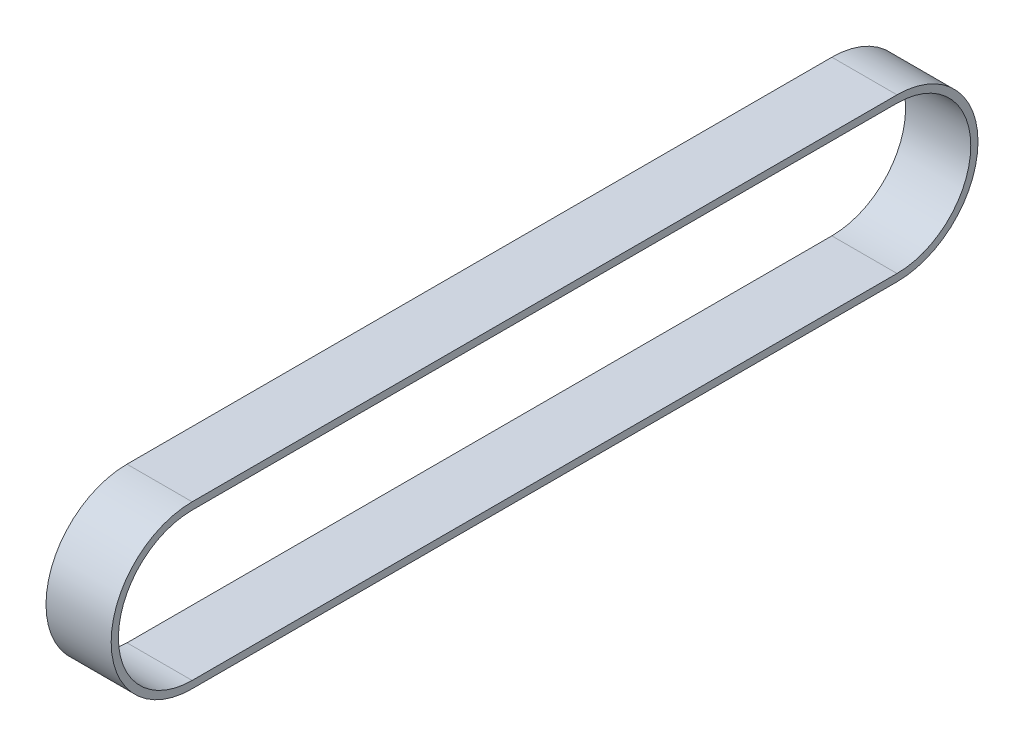
ISO-10303-21;
HEADER;
FILE_DESCRIPTION(('STEP AP214'),'2;1');
FILE_NAME('part.step','',(''),(''),'','','');
FILE_SCHEMA(('AUTOMOTIVE_DESIGN { 1 0 10303 214 1 1 1 1 }'));
ENDSEC;
DATA;
#1=APPLICATION_CONTEXT('core data for automotive mechanical design processes');
#2=APPLICATION_PROTOCOL_DEFINITION('international standard','automotive_design',2000,#1);
#3=PRODUCT_CONTEXT('',#1,'mechanical');
#4=PRODUCT('Part','Part','',(#3));
#5=PRODUCT_RELATED_PRODUCT_CATEGORY('part','',(#4));
#6=PRODUCT_DEFINITION_FORMATION('','',#4);
#7=PRODUCT_DEFINITION_CONTEXT('part definition',#1,'design');
#8=PRODUCT_DEFINITION('design','',#6,#7);
#9=PRODUCT_DEFINITION_SHAPE('','',#8);
#10=(LENGTH_UNIT() NAMED_UNIT(*) SI_UNIT(.MILLI.,.METRE.));
#11=(NAMED_UNIT(*) PLANE_ANGLE_UNIT() SI_UNIT($,.RADIAN.));
#12=(NAMED_UNIT(*) SI_UNIT($,.STERADIAN.) SOLID_ANGLE_UNIT());
#13=UNCERTAINTY_MEASURE_WITH_UNIT(LENGTH_MEASURE(1.E-05),#10,'distance_accuracy_value','');
#14=(GEOMETRIC_REPRESENTATION_CONTEXT(3) GLOBAL_UNCERTAINTY_ASSIGNED_CONTEXT((#13)) GLOBAL_UNIT_ASSIGNED_CONTEXT((#10,
#11,#12)) REPRESENTATION_CONTEXT('',''));
#15=CARTESIAN_POINT('',(0.,0.,0.));
#16=DIRECTION('',(0.,0.,1.));
#17=DIRECTION('',(1.,0.,0.));
#18=AXIS2_PLACEMENT_3D('',#15,#16,#17);
#19=CARTESIAN_POINT('',(4.5,0.,97.36128617));
#20=DIRECTION('',(1.,0.,0.));
#21=DIRECTION('',(0.,0.,-1.));
#22=AXIS2_PLACEMENT_3D('',#19,#20,#21);
#23=PLANE('',#22);
#24=CARTESIAN_POINT('',(4.5,0.,97.36128617));
#25=DIRECTION('',(1.,0.,0.));
#26=DIRECTION('',(0.,0.,-1.));
#27=AXIS2_PLACEMENT_3D('',#24,#25,#26);
#28=CIRCLE('',#27,11.185);
#29=CARTESIAN_POINT('',(4.5,11.185,97.36128617));
#30=VERTEX_POINT('',#29);
#31=CARTESIAN_POINT('',(4.5,-11.185,97.36128617));
#32=VERTEX_POINT('',#31);
#33=EDGE_CURVE('E179',#30,#32,#28,.T.);
#34=ORIENTED_EDGE('',*,*,#33,.T.);
#35=DIRECTION('',(0.,0.,-1.));
#36=VECTOR('',#35,1.);
#37=CARTESIAN_POINT('',(4.5,-11.185,0.));
#38=LINE('',#37,#36);
#39=CARTESIAN_POINT('',(4.5,-11.185,0.));
#40=VERTEX_POINT('',#39);
#41=EDGE_CURVE('E183',#32,#40,#38,.T.);
#42=ORIENTED_EDGE('',*,*,#41,.T.);
#43=CARTESIAN_POINT('',(4.5,0.,0.));
#44=DIRECTION('',(1.,0.,0.));
#45=DIRECTION('',(0.,0.,-1.));
#46=AXIS2_PLACEMENT_3D('',#43,#44,#45);
#47=CIRCLE('',#46,11.185);
#48=CARTESIAN_POINT('',(4.5,11.185,0.));
#49=VERTEX_POINT('',#48);
#50=EDGE_CURVE('E187',#40,#49,#47,.T.);
#51=ORIENTED_EDGE('',*,*,#50,.T.);
#52=DIRECTION('',(0.,0.,1.));
#53=VECTOR('',#52,1.);
#54=CARTESIAN_POINT('',(4.5,11.185,97.36128617));
#55=LINE('',#54,#53);
#56=EDGE_CURVE('E190',#49,#30,#55,.T.);
#57=ORIENTED_EDGE('',*,*,#56,.T.);
#58=EDGE_LOOP('',(#34,#42,#51,#57));
#59=FACE_BOUND('',#58,.T.);
#60=DIRECTION('',(0.,0.,-1.));
#61=VECTOR('',#60,1.);
#62=CARTESIAN_POINT('',(4.5,-10.185,0.));
#63=LINE('',#62,#61);
#64=CARTESIAN_POINT('',(4.5,-10.185,97.36128617));
#65=VERTEX_POINT('',#64);
#66=CARTESIAN_POINT('',(4.5,-10.185,0.));
#67=VERTEX_POINT('',#66);
#68=EDGE_CURVE('E139',#65,#67,#63,.T.);
#69=ORIENTED_EDGE('',*,*,#68,.F.);
#70=CARTESIAN_POINT('',(4.5,0.,97.36128617));
#71=DIRECTION('',(1.,0.,0.));
#72=DIRECTION('',(0.,0.,-1.));
#73=AXIS2_PLACEMENT_3D('',#70,#71,#72);
#74=CIRCLE('',#73,10.185);
#75=CARTESIAN_POINT('',(4.5,10.185,97.36128617));
#76=VERTEX_POINT('',#75);
#77=EDGE_CURVE('E130',#76,#65,#74,.T.);
#78=ORIENTED_EDGE('',*,*,#77,.F.);
#79=DIRECTION('',(0.,0.,1.));
#80=VECTOR('',#79,1.);
#81=CARTESIAN_POINT('',(4.5,10.185,97.36128617));
#82=LINE('',#81,#80);
#83=CARTESIAN_POINT('',(4.5,10.185,0.));
#84=VERTEX_POINT('',#83);
#85=EDGE_CURVE('E157',#84,#76,#82,.T.);
#86=ORIENTED_EDGE('',*,*,#85,.F.);
#87=CARTESIAN_POINT('',(4.5,0.,0.));
#88=DIRECTION('',(1.,0.,0.));
#89=DIRECTION('',(0.,0.,-1.));
#90=AXIS2_PLACEMENT_3D('',#87,#88,#89);
#91=CIRCLE('',#90,10.185);
#92=EDGE_CURVE('E152',#67,#84,#91,.T.);
#93=ORIENTED_EDGE('',*,*,#92,.F.);
#94=EDGE_LOOP('',(#69,#78,#86,#93));
#95=FACE_BOUND('',#94,.T.);
#96=ADVANCED_FACE('F64',(#59,#95),#23,.T.);
#97=CARTESIAN_POINT('',(-4.5,0.,97.36128617));
#98=DIRECTION('',(1.,0.,0.));
#99=DIRECTION('',(0.,0.,-1.));
#100=AXIS2_PLACEMENT_3D('',#97,#98,#99);
#101=PLANE('',#100);
#102=CARTESIAN_POINT('',(-4.5,0.,97.36128617));
#103=DIRECTION('',(1.,0.,0.));
#104=DIRECTION('',(0.,0.,-1.));
#105=AXIS2_PLACEMENT_3D('',#102,#103,#104);
#106=CIRCLE('',#105,11.185);
#107=CARTESIAN_POINT('',(-4.5,11.185,97.36128617));
#108=VERTEX_POINT('',#107);
#109=CARTESIAN_POINT('',(-4.5,-11.185,97.36128617));
#110=VERTEX_POINT('',#109);
#111=EDGE_CURVE('E148',#108,#110,#106,.T.);
#112=ORIENTED_EDGE('',*,*,#111,.F.);
#113=DIRECTION('',(0.,0.,1.));
#114=VECTOR('',#113,1.);
#115=CARTESIAN_POINT('',(-4.5,11.185,97.36128617));
#116=LINE('',#115,#114);
#117=CARTESIAN_POINT('',(-4.5,11.185,0.));
#118=VERTEX_POINT('',#117);
#119=EDGE_CURVE('E184',#118,#108,#116,.T.);
#120=ORIENTED_EDGE('',*,*,#119,.F.);
#121=CARTESIAN_POINT('',(-4.5,0.,0.));
#122=DIRECTION('',(1.,0.,0.));
#123=DIRECTION('',(0.,0.,-1.));
#124=AXIS2_PLACEMENT_3D('',#121,#122,#123);
#125=CIRCLE('',#124,11.185);
#126=CARTESIAN_POINT('',(-4.5,-11.185,0.));
#127=VERTEX_POINT('',#126);
#128=EDGE_CURVE('E200',#127,#118,#125,.T.);
#129=ORIENTED_EDGE('',*,*,#128,.F.);
#130=DIRECTION('',(0.,0.,-1.));
#131=VECTOR('',#130,1.);
#132=CARTESIAN_POINT('',(-4.5,-11.185,0.));
#133=LINE('',#132,#131);
#134=EDGE_CURVE('E197',#110,#127,#133,.T.);
#135=ORIENTED_EDGE('',*,*,#134,.F.);
#136=EDGE_LOOP('',(#112,#120,#129,#135));
#137=FACE_BOUND('',#136,.T.);
#138=CARTESIAN_POINT('',(-4.5,0.,97.36128617));
#139=DIRECTION('',(1.,0.,0.));
#140=DIRECTION('',(0.,0.,-1.));
#141=AXIS2_PLACEMENT_3D('',#138,#139,#140);
#142=CIRCLE('',#141,10.185);
#143=CARTESIAN_POINT('',(-4.5,10.185,97.36128617));
#144=VERTEX_POINT('',#143);
#145=CARTESIAN_POINT('',(-4.5,-10.185,97.36128617));
#146=VERTEX_POINT('',#145);
#147=EDGE_CURVE('E88',#144,#146,#142,.T.);
#148=ORIENTED_EDGE('',*,*,#147,.T.);
#149=DIRECTION('',(0.,0.,-1.));
#150=VECTOR('',#149,1.);
#151=CARTESIAN_POINT('',(-4.5,-10.185,0.));
#152=LINE('',#151,#150);
#153=CARTESIAN_POINT('',(-4.5,-10.185,0.));
#154=VERTEX_POINT('',#153);
#155=EDGE_CURVE('E146',#146,#154,#152,.T.);
#156=ORIENTED_EDGE('',*,*,#155,.T.);
#157=CARTESIAN_POINT('',(-4.5,0.,0.));
#158=DIRECTION('',(1.,0.,0.));
#159=DIRECTION('',(0.,0.,-1.));
#160=AXIS2_PLACEMENT_3D('',#157,#158,#159);
#161=CIRCLE('',#160,10.185);
#162=CARTESIAN_POINT('',(-4.5,10.185,0.));
#163=VERTEX_POINT('',#162);
#164=EDGE_CURVE('E166',#154,#163,#161,.T.);
#165=ORIENTED_EDGE('',*,*,#164,.T.);
#166=DIRECTION('',(0.,0.,1.));
#167=VECTOR('',#166,1.);
#168=CARTESIAN_POINT('',(-4.5,10.185,97.36128617));
#169=LINE('',#168,#167);
#170=EDGE_CURVE('E140',#163,#144,#169,.T.);
#171=ORIENTED_EDGE('',*,*,#170,.T.);
#172=EDGE_LOOP('',(#148,#156,#165,#171));
#173=FACE_BOUND('',#172,.T.);
#174=ADVANCED_FACE('F224',(#137,#173),#101,.F.);
#175=CARTESIAN_POINT('',(4.5,0.,97.36128617));
#176=DIRECTION('',(-1.,0.,0.));
#177=DIRECTION('',(0.,0.,1.));
#178=AXIS2_PLACEMENT_3D('',#175,#176,#177);
#179=CYLINDRICAL_SURFACE('',#178,11.185);
#180=ORIENTED_EDGE('',*,*,#111,.T.);
#181=DIRECTION('',(-1.,0.,0.));
#182=VECTOR('',#181,1.);
#183=CARTESIAN_POINT('',(4.5,-11.185,97.36128617));
#184=LINE('',#183,#182);
#185=EDGE_CURVE('E12',#32,#110,#184,.T.);
#186=ORIENTED_EDGE('',*,*,#185,.F.);
#187=ORIENTED_EDGE('',*,*,#33,.F.);
#188=DIRECTION('',(-1.,0.,0.));
#189=VECTOR('',#188,1.);
#190=CARTESIAN_POINT('',(4.5,11.185,97.36128617));
#191=LINE('',#190,#189);
#192=EDGE_CURVE('E193',#30,#108,#191,.T.);
#193=ORIENTED_EDGE('',*,*,#192,.T.);
#194=EDGE_LOOP('',(#180,#186,#187,#193));
#195=FACE_BOUND('',#194,.T.);
#196=ADVANCED_FACE('F66',(#195),#179,.T.);
#197=CARTESIAN_POINT('',(4.5,-11.185,0.));
#198=DIRECTION('',(0.,1.,0.));
#199=DIRECTION('',(0.,0.,1.));
#200=AXIS2_PLACEMENT_3D('',#197,#198,#199);
#201=PLANE('',#200);
#202=ORIENTED_EDGE('',*,*,#134,.T.);
#203=DIRECTION('',(-1.,0.,0.));
#204=VECTOR('',#203,1.);
#205=CARTESIAN_POINT('',(4.5,-11.185,0.));
#206=LINE('',#205,#204);
#207=EDGE_CURVE('E73',#40,#127,#206,.T.);
#208=ORIENTED_EDGE('',*,*,#207,.F.);
#209=ORIENTED_EDGE('',*,*,#41,.F.);
#210=ORIENTED_EDGE('',*,*,#185,.T.);
#211=EDGE_LOOP('',(#202,#208,#209,#210));
#212=FACE_BOUND('',#211,.T.);
#213=ADVANCED_FACE('F234',(#212),#201,.F.);
#214=CARTESIAN_POINT('',(4.5,0.,0.));
#215=DIRECTION('',(-1.,0.,0.));
#216=DIRECTION('',(0.,0.,1.));
#217=AXIS2_PLACEMENT_3D('',#214,#215,#216);
#218=CYLINDRICAL_SURFACE('',#217,11.185);
#219=ORIENTED_EDGE('',*,*,#128,.T.);
#220=DIRECTION('',(-1.,0.,0.));
#221=VECTOR('',#220,1.);
#222=CARTESIAN_POINT('',(4.5,11.185,0.));
#223=LINE('',#222,#221);
#224=EDGE_CURVE('E208',#49,#118,#223,.T.);
#225=ORIENTED_EDGE('',*,*,#224,.F.);
#226=ORIENTED_EDGE('',*,*,#50,.F.);
#227=ORIENTED_EDGE('',*,*,#207,.T.);
#228=EDGE_LOOP('',(#219,#225,#226,#227));
#229=FACE_BOUND('',#228,.T.);
#230=ADVANCED_FACE('F218',(#229),#218,.T.);
#231=CARTESIAN_POINT('',(4.5,11.185,97.36128617));
#232=DIRECTION('',(0.,-1.,0.));
#233=DIRECTION('',(0.,0.,-1.));
#234=AXIS2_PLACEMENT_3D('',#231,#232,#233);
#235=PLANE('',#234);
#236=ORIENTED_EDGE('',*,*,#119,.T.);
#237=ORIENTED_EDGE('',*,*,#192,.F.);
#238=ORIENTED_EDGE('',*,*,#56,.F.);
#239=ORIENTED_EDGE('',*,*,#224,.T.);
#240=EDGE_LOOP('',(#236,#237,#238,#239));
#241=FACE_BOUND('',#240,.T.);
#242=ADVANCED_FACE('F228',(#241),#235,.F.);
#243=CARTESIAN_POINT('',(4.5,0.,97.36128617));
#244=DIRECTION('',(-1.,0.,0.));
#245=DIRECTION('',(0.,0.,1.));
#246=AXIS2_PLACEMENT_3D('',#243,#244,#245);
#247=CYLINDRICAL_SURFACE('',#246,10.185);
#248=ORIENTED_EDGE('',*,*,#147,.F.);
#249=DIRECTION('',(-1.,0.,0.));
#250=VECTOR('',#249,1.);
#251=CARTESIAN_POINT('',(4.5,10.185,97.36128617));
#252=LINE('',#251,#250);
#253=EDGE_CURVE('E134',#76,#144,#252,.T.);
#254=ORIENTED_EDGE('',*,*,#253,.F.);
#255=ORIENTED_EDGE('',*,*,#77,.T.);
#256=DIRECTION('',(-1.,0.,0.));
#257=VECTOR('',#256,1.);
#258=CARTESIAN_POINT('',(4.5,-10.185,97.36128617));
#259=LINE('',#258,#257);
#260=EDGE_CURVE('E133',#65,#146,#259,.T.);
#261=ORIENTED_EDGE('',*,*,#260,.T.);
#262=EDGE_LOOP('',(#248,#254,#255,#261));
#263=FACE_BOUND('',#262,.T.);
#264=ADVANCED_FACE('F132',(#263),#247,.F.);
#265=CARTESIAN_POINT('',(4.5,-10.185,0.));
#266=DIRECTION('',(0.,1.,0.));
#267=DIRECTION('',(0.,0.,1.));
#268=AXIS2_PLACEMENT_3D('',#265,#266,#267);
#269=PLANE('',#268);
#270=ORIENTED_EDGE('',*,*,#155,.F.);
#271=ORIENTED_EDGE('',*,*,#260,.F.);
#272=ORIENTED_EDGE('',*,*,#68,.T.);
#273=DIRECTION('',(-1.,0.,0.));
#274=VECTOR('',#273,1.);
#275=CARTESIAN_POINT('',(4.5,-10.185,0.));
#276=LINE('',#275,#274);
#277=EDGE_CURVE('E149',#67,#154,#276,.T.);
#278=ORIENTED_EDGE('',*,*,#277,.T.);
#279=EDGE_LOOP('',(#270,#271,#272,#278));
#280=FACE_BOUND('',#279,.T.);
#281=ADVANCED_FACE('F143',(#280),#269,.T.);
#282=CARTESIAN_POINT('',(4.5,0.,0.));
#283=DIRECTION('',(-1.,0.,0.));
#284=DIRECTION('',(0.,0.,1.));
#285=AXIS2_PLACEMENT_3D('',#282,#283,#284);
#286=CYLINDRICAL_SURFACE('',#285,10.185);
#287=ORIENTED_EDGE('',*,*,#164,.F.);
#288=ORIENTED_EDGE('',*,*,#277,.F.);
#289=ORIENTED_EDGE('',*,*,#92,.T.);
#290=DIRECTION('',(-1.,0.,0.));
#291=VECTOR('',#290,1.);
#292=CARTESIAN_POINT('',(4.5,10.185,0.));
#293=LINE('',#292,#291);
#294=EDGE_CURVE('E80',#84,#163,#293,.T.);
#295=ORIENTED_EDGE('',*,*,#294,.T.);
#296=EDGE_LOOP('',(#287,#288,#289,#295));
#297=FACE_BOUND('',#296,.T.);
#298=ADVANCED_FACE('F257',(#297),#286,.F.);
#299=CARTESIAN_POINT('',(4.5,10.185,97.36128617));
#300=DIRECTION('',(0.,-1.,0.));
#301=DIRECTION('',(0.,0.,-1.));
#302=AXIS2_PLACEMENT_3D('',#299,#300,#301);
#303=PLANE('',#302);
#304=ORIENTED_EDGE('',*,*,#170,.F.);
#305=ORIENTED_EDGE('',*,*,#294,.F.);
#306=ORIENTED_EDGE('',*,*,#85,.T.);
#307=ORIENTED_EDGE('',*,*,#253,.T.);
#308=EDGE_LOOP('',(#304,#305,#306,#307));
#309=FACE_BOUND('',#308,.T.);
#310=ADVANCED_FACE('F261',(#309),#303,.T.);
#311=CLOSED_SHELL('',(#96,#174,#196,#213,#230,#242,#264,#281,#298,#310));
#312=MANIFOLD_SOLID_BREP('B2',#311);
#313=ADVANCED_BREP_SHAPE_REPRESENTATION('',(#18,#312),#14);
#314=SHAPE_DEFINITION_REPRESENTATION(#9,#313);
ENDSEC;
END-ISO-10303-21;
